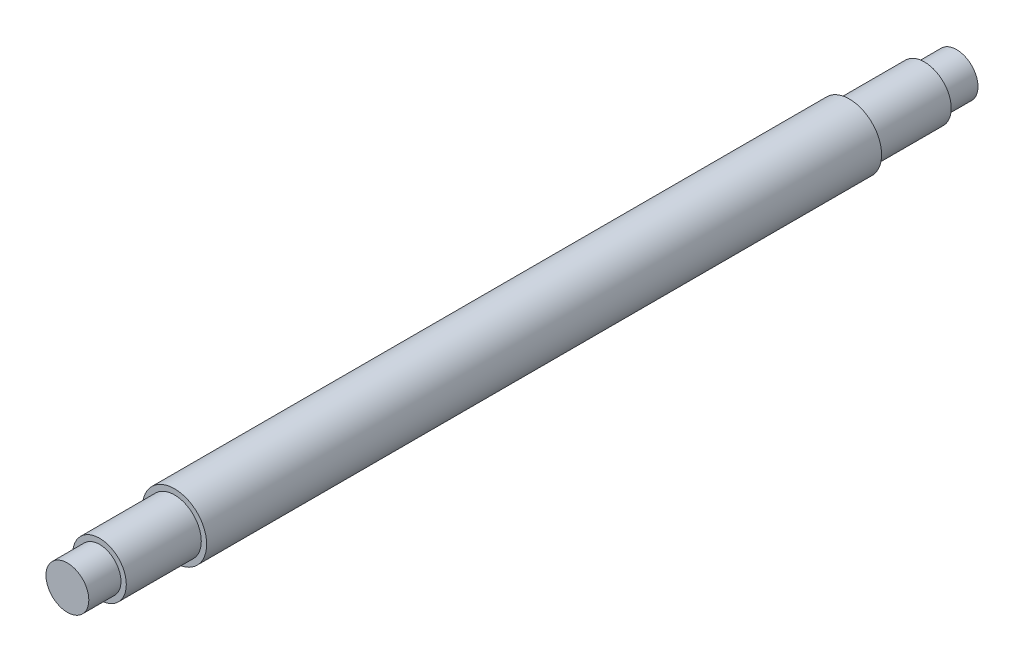
ISO-10303-21;
HEADER;
FILE_DESCRIPTION(('STEP AP214'),'2;1');
FILE_NAME('part.step','',(''),(''),'','','');
FILE_SCHEMA(('AUTOMOTIVE_DESIGN { 1 0 10303 214 1 1 1 1 }'));
ENDSEC;
DATA;
#1=APPLICATION_CONTEXT('core data for automotive mechanical design processes');
#2=APPLICATION_PROTOCOL_DEFINITION('international standard','automotive_design',2000,#1);
#3=PRODUCT_CONTEXT('',#1,'mechanical');
#4=PRODUCT('Part','Part','',(#3));
#5=PRODUCT_RELATED_PRODUCT_CATEGORY('part','',(#4));
#6=PRODUCT_DEFINITION_FORMATION('','',#4);
#7=PRODUCT_DEFINITION_CONTEXT('part definition',#1,'design');
#8=PRODUCT_DEFINITION('design','',#6,#7);
#9=PRODUCT_DEFINITION_SHAPE('','',#8);
#10=(LENGTH_UNIT() NAMED_UNIT(*) SI_UNIT(.MILLI.,.METRE.));
#11=(NAMED_UNIT(*) PLANE_ANGLE_UNIT() SI_UNIT($,.RADIAN.));
#12=(NAMED_UNIT(*) SI_UNIT($,.STERADIAN.) SOLID_ANGLE_UNIT());
#13=UNCERTAINTY_MEASURE_WITH_UNIT(LENGTH_MEASURE(1.E-05),#10,'distance_accuracy_value','');
#14=(GEOMETRIC_REPRESENTATION_CONTEXT(3) GLOBAL_UNCERTAINTY_ASSIGNED_CONTEXT((#13)) GLOBAL_UNIT_ASSIGNED_CONTEXT((#10,
#11,#12)) REPRESENTATION_CONTEXT('',''));
#15=CARTESIAN_POINT('',(0.,0.,0.));
#16=DIRECTION('',(0.,0.,1.));
#17=DIRECTION('',(1.,0.,0.));
#18=AXIS2_PLACEMENT_3D('',#15,#16,#17);
#19=CARTESIAN_POINT('',(0.,0.,0.));
#20=DIRECTION('',(0.,0.,-1.));
#21=DIRECTION('',(-1.,0.,0.));
#22=AXIS2_PLACEMENT_3D('',#19,#20,#21);
#23=PLANE('',#22);
#24=CARTESIAN_POINT('',(0.,0.,0.));
#25=DIRECTION('',(0.,0.,1.));
#26=DIRECTION('',(1.,0.,0.));
#27=AXIS2_PLACEMENT_3D('',#24,#25,#26);
#28=CIRCLE('',#27,2.);
#29=CARTESIAN_POINT('',(2.,0.,0.));
#30=VERTEX_POINT('',#29);
#31=EDGE_CURVE('E10',#30,#30,#28,.T.);
#32=ORIENTED_EDGE('',*,*,#31,.T.);
#33=EDGE_LOOP('',(#32));
#34=FACE_BOUND('',#33,.T.);
#35=ADVANCED_FACE('F39',(#34),#23,.F.);
#36=CARTESIAN_POINT('',(0.,0.,10.0733410365769));
#37=DIRECTION('',(0.,0.,1.));
#38=DIRECTION('',(1.,0.,0.));
#39=AXIS2_PLACEMENT_3D('',#36,#37,#38);
#40=CYLINDRICAL_SURFACE('',#39,2.);
#41=ORIENTED_EDGE('',*,*,#31,.F.);
#42=EDGE_LOOP('',(#41));
#43=FACE_BOUND('',#42,.T.);
#44=CARTESIAN_POINT('',(0.,0.,-3.));
#45=DIRECTION('',(0.,0.,1.));
#46=DIRECTION('',(1.,0.,0.));
#47=AXIS2_PLACEMENT_3D('',#44,#45,#46);
#48=CIRCLE('',#47,2.);
#49=CARTESIAN_POINT('',(2.,0.,-3.));
#50=VERTEX_POINT('',#49);
#51=EDGE_CURVE('E45',#50,#50,#48,.T.);
#52=ORIENTED_EDGE('',*,*,#51,.T.);
#53=EDGE_LOOP('',(#52));
#54=FACE_BOUND('',#53,.T.);
#55=ADVANCED_FACE('F90',(#43,#54),#40,.T.);
#56=CARTESIAN_POINT('',(0.,2.5,-3.));
#57=DIRECTION('',(0.,0.,-1.));
#58=DIRECTION('',(-1.,0.,0.));
#59=AXIS2_PLACEMENT_3D('',#56,#57,#58);
#60=PLANE('',#59);
#61=ORIENTED_EDGE('',*,*,#51,.F.);
#62=EDGE_LOOP('',(#61));
#63=FACE_BOUND('',#62,.T.);
#64=CARTESIAN_POINT('',(0.,0.,-3.));
#65=DIRECTION('',(0.,0.,1.));
#66=DIRECTION('',(1.,0.,0.));
#67=AXIS2_PLACEMENT_3D('',#64,#65,#66);
#68=CIRCLE('',#67,2.5);
#69=CARTESIAN_POINT('',(2.5,0.,-3.));
#70=VERTEX_POINT('',#69);
#71=EDGE_CURVE('E49',#70,#70,#68,.T.);
#72=ORIENTED_EDGE('',*,*,#71,.T.);
#73=EDGE_LOOP('',(#72));
#74=FACE_BOUND('',#73,.T.);
#75=ADVANCED_FACE('F95',(#63,#74),#60,.F.);
#76=CARTESIAN_POINT('',(0.,0.,10.0733410365769));
#77=DIRECTION('',(0.,0.,1.));
#78=DIRECTION('',(1.,0.,0.));
#79=AXIS2_PLACEMENT_3D('',#76,#77,#78);
#80=CYLINDRICAL_SURFACE('',#79,2.5);
#81=ORIENTED_EDGE('',*,*,#71,.F.);
#82=EDGE_LOOP('',(#81));
#83=FACE_BOUND('',#82,.T.);
#84=CARTESIAN_POINT('',(0.,0.,-10.));
#85=DIRECTION('',(0.,0.,1.));
#86=DIRECTION('',(1.,0.,0.));
#87=AXIS2_PLACEMENT_3D('',#84,#85,#86);
#88=CIRCLE('',#87,2.5);
#89=CARTESIAN_POINT('',(2.5,0.,-10.));
#90=VERTEX_POINT('',#89);
#91=EDGE_CURVE('E53',#90,#90,#88,.T.);
#92=ORIENTED_EDGE('',*,*,#91,.T.);
#93=EDGE_LOOP('',(#92));
#94=FACE_BOUND('',#93,.T.);
#95=ADVANCED_FACE('F99',(#83,#94),#80,.T.);
#96=CARTESIAN_POINT('',(0.,2.5,-10.));
#97=DIRECTION('',(0.,0.,-1.));
#98=DIRECTION('',(-1.,0.,0.));
#99=AXIS2_PLACEMENT_3D('',#96,#97,#98);
#100=PLANE('',#99);
#101=ORIENTED_EDGE('',*,*,#91,.F.);
#102=EDGE_LOOP('',(#101));
#103=FACE_BOUND('',#102,.T.);
#104=CARTESIAN_POINT('',(0.,0.,-10.));
#105=DIRECTION('',(0.,0.,1.));
#106=DIRECTION('',(1.,0.,0.));
#107=AXIS2_PLACEMENT_3D('',#104,#105,#106);
#108=CIRCLE('',#107,3.);
#109=CARTESIAN_POINT('',(3.,0.,-10.));
#110=VERTEX_POINT('',#109);
#111=EDGE_CURVE('E58',#110,#110,#108,.T.);
#112=ORIENTED_EDGE('',*,*,#111,.T.);
#113=EDGE_LOOP('',(#112));
#114=FACE_BOUND('',#113,.T.);
#115=ADVANCED_FACE('F105',(#103,#114),#100,.F.);
#116=CARTESIAN_POINT('',(0.,0.,10.0733410365769));
#117=DIRECTION('',(0.,0.,1.));
#118=DIRECTION('',(1.,0.,0.));
#119=AXIS2_PLACEMENT_3D('',#116,#117,#118);
#120=CYLINDRICAL_SURFACE('',#119,3.);
#121=ORIENTED_EDGE('',*,*,#111,.F.);
#122=EDGE_LOOP('',(#121));
#123=FACE_BOUND('',#122,.T.);
#124=CARTESIAN_POINT('',(0.,0.,-73.));
#125=DIRECTION('',(0.,0.,1.));
#126=DIRECTION('',(1.,0.,0.));
#127=AXIS2_PLACEMENT_3D('',#124,#125,#126);
#128=CIRCLE('',#127,3.);
#129=CARTESIAN_POINT('',(3.,0.,-73.));
#130=VERTEX_POINT('',#129);
#131=EDGE_CURVE('E61',#130,#130,#128,.T.);
#132=ORIENTED_EDGE('',*,*,#131,.T.);
#133=EDGE_LOOP('',(#132));
#134=FACE_BOUND('',#133,.T.);
#135=ADVANCED_FACE('F109',(#123,#134),#120,.T.);
#136=CARTESIAN_POINT('',(0.,3.,-73.));
#137=DIRECTION('',(0.,0.,1.));
#138=DIRECTION('',(1.,0.,0.));
#139=AXIS2_PLACEMENT_3D('',#136,#137,#138);
#140=PLANE('',#139);
#141=ORIENTED_EDGE('',*,*,#131,.F.);
#142=EDGE_LOOP('',(#141));
#143=FACE_BOUND('',#142,.T.);
#144=CARTESIAN_POINT('',(0.,0.,-73.));
#145=DIRECTION('',(0.,0.,1.));
#146=DIRECTION('',(1.,0.,0.));
#147=AXIS2_PLACEMENT_3D('',#144,#145,#146);
#148=CIRCLE('',#147,2.5);
#149=CARTESIAN_POINT('',(2.5,0.,-73.));
#150=VERTEX_POINT('',#149);
#151=EDGE_CURVE('E64',#150,#150,#148,.T.);
#152=ORIENTED_EDGE('',*,*,#151,.T.);
#153=EDGE_LOOP('',(#152));
#154=FACE_BOUND('',#153,.T.);
#155=ADVANCED_FACE('F113',(#143,#154),#140,.F.);
#156=CARTESIAN_POINT('',(0.,0.,10.0733410365769));
#157=DIRECTION('',(0.,0.,1.));
#158=DIRECTION('',(1.,0.,0.));
#159=AXIS2_PLACEMENT_3D('',#156,#157,#158);
#160=CYLINDRICAL_SURFACE('',#159,2.5);
#161=ORIENTED_EDGE('',*,*,#151,.F.);
#162=EDGE_LOOP('',(#161));
#163=FACE_BOUND('',#162,.T.);
#164=CARTESIAN_POINT('',(0.,0.,-80.));
#165=DIRECTION('',(0.,0.,1.));
#166=DIRECTION('',(1.,0.,0.));
#167=AXIS2_PLACEMENT_3D('',#164,#165,#166);
#168=CIRCLE('',#167,2.5);
#169=CARTESIAN_POINT('',(2.5,0.,-80.));
#170=VERTEX_POINT('',#169);
#171=EDGE_CURVE('E67',#170,#170,#168,.T.);
#172=ORIENTED_EDGE('',*,*,#171,.T.);
#173=EDGE_LOOP('',(#172));
#174=FACE_BOUND('',#173,.T.);
#175=ADVANCED_FACE('F117',(#163,#174),#160,.T.);
#176=CARTESIAN_POINT('',(0.,2.5,-80.));
#177=DIRECTION('',(0.,0.,1.));
#178=DIRECTION('',(1.,0.,0.));
#179=AXIS2_PLACEMENT_3D('',#176,#177,#178);
#180=PLANE('',#179);
#181=ORIENTED_EDGE('',*,*,#171,.F.);
#182=EDGE_LOOP('',(#181));
#183=FACE_BOUND('',#182,.T.);
#184=CARTESIAN_POINT('',(0.,0.,-80.));
#185=DIRECTION('',(0.,0.,1.));
#186=DIRECTION('',(1.,0.,0.));
#187=AXIS2_PLACEMENT_3D('',#184,#185,#186);
#188=CIRCLE('',#187,2.00000000000001);
#189=CARTESIAN_POINT('',(2.00000000000001,0.,-80.));
#190=VERTEX_POINT('',#189);
#191=EDGE_CURVE('E70',#190,#190,#188,.T.);
#192=ORIENTED_EDGE('',*,*,#191,.T.);
#193=EDGE_LOOP('',(#192));
#194=FACE_BOUND('',#193,.T.);
#195=ADVANCED_FACE('F86',(#183,#194),#180,.F.);
#196=CARTESIAN_POINT('',(0.,0.,10.0733410365769));
#197=DIRECTION('',(0.,0.,1.));
#198=DIRECTION('',(1.,0.,0.));
#199=AXIS2_PLACEMENT_3D('',#196,#197,#198);
#200=CYLINDRICAL_SURFACE('',#199,2.00000000000001);
#201=ORIENTED_EDGE('',*,*,#191,.F.);
#202=EDGE_LOOP('',(#201));
#203=FACE_BOUND('',#202,.T.);
#204=CARTESIAN_POINT('',(0.,0.,-83.));
#205=DIRECTION('',(0.,0.,1.));
#206=DIRECTION('',(1.,0.,0.));
#207=AXIS2_PLACEMENT_3D('',#204,#205,#206);
#208=CIRCLE('',#207,2.00000000000001);
#209=CARTESIAN_POINT('',(2.00000000000001,0.,-83.));
#210=VERTEX_POINT('',#209);
#211=EDGE_CURVE('E73',#210,#210,#208,.T.);
#212=ORIENTED_EDGE('',*,*,#211,.T.);
#213=EDGE_LOOP('',(#212));
#214=FACE_BOUND('',#213,.T.);
#215=ADVANCED_FACE('F77',(#203,#214),#200,.T.);
#216=CARTESIAN_POINT('',(0.,2.00000000000001,-83.));
#217=DIRECTION('',(0.,0.,1.));
#218=DIRECTION('',(1.,0.,0.));
#219=AXIS2_PLACEMENT_3D('',#216,#217,#218);
#220=PLANE('',#219);
#221=ORIENTED_EDGE('',*,*,#211,.F.);
#222=EDGE_LOOP('',(#221));
#223=FACE_BOUND('',#222,.T.);
#224=ADVANCED_FACE('F79',(#223),#220,.F.);
#225=CLOSED_SHELL('',(#35,#55,#75,#95,#115,#135,#155,#175,#195,#215,#224));
#226=MANIFOLD_SOLID_BREP('B2',#225);
#227=ADVANCED_BREP_SHAPE_REPRESENTATION('',(#18,#226),#14);
#228=SHAPE_DEFINITION_REPRESENTATION(#9,#227);
ENDSEC;
END-ISO-10303-21;
